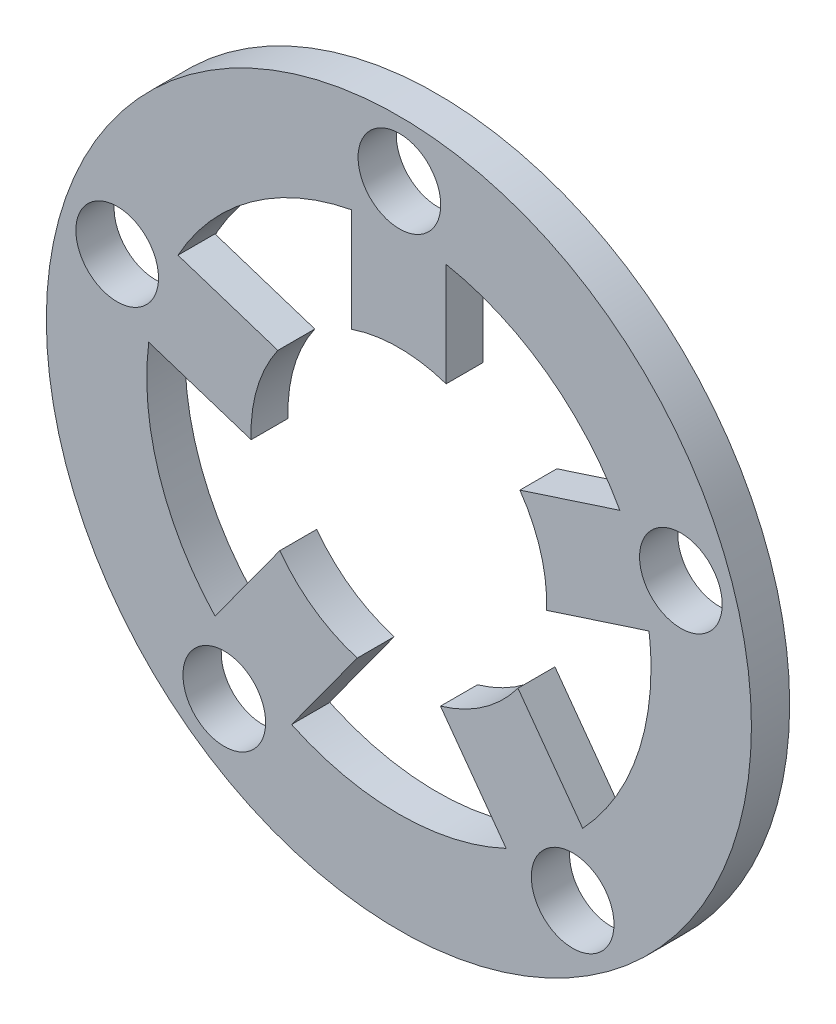
ISO-10303-21;
HEADER;
FILE_DESCRIPTION(('STEP AP214'),'2;1');
FILE_NAME('part.step','',(''),(''),'','','');
FILE_SCHEMA(('AUTOMOTIVE_DESIGN { 1 0 10303 214 1 1 1 1 }'));
ENDSEC;
DATA;
#1=APPLICATION_CONTEXT('core data for automotive mechanical design processes');
#2=APPLICATION_PROTOCOL_DEFINITION('international standard','automotive_design',2000,#1);
#3=PRODUCT_CONTEXT('',#1,'mechanical');
#4=PRODUCT('Part','Part','',(#3));
#5=PRODUCT_RELATED_PRODUCT_CATEGORY('part','',(#4));
#6=PRODUCT_DEFINITION_FORMATION('','',#4);
#7=PRODUCT_DEFINITION_CONTEXT('part definition',#1,'design');
#8=PRODUCT_DEFINITION('design','',#6,#7);
#9=PRODUCT_DEFINITION_SHAPE('','',#8);
#10=(LENGTH_UNIT() NAMED_UNIT(*) SI_UNIT(.MILLI.,.METRE.));
#11=(NAMED_UNIT(*) PLANE_ANGLE_UNIT() SI_UNIT($,.RADIAN.));
#12=(NAMED_UNIT(*) SI_UNIT($,.STERADIAN.) SOLID_ANGLE_UNIT());
#13=UNCERTAINTY_MEASURE_WITH_UNIT(LENGTH_MEASURE(1.E-05),#10,'distance_accuracy_value','');
#14=(GEOMETRIC_REPRESENTATION_CONTEXT(3) GLOBAL_UNCERTAINTY_ASSIGNED_CONTEXT((#13)) GLOBAL_UNIT_ASSIGNED_CONTEXT((#10,
#11,#12)) REPRESENTATION_CONTEXT('',''));
#15=CARTESIAN_POINT('',(0.,0.,0.));
#16=DIRECTION('',(0.,0.,1.));
#17=DIRECTION('',(1.,0.,0.));
#18=AXIS2_PLACEMENT_3D('',#15,#16,#17);
#19=CARTESIAN_POINT('',(3.90838090677538,20.8361843898723,-0.401310706385936));
#20=DIRECTION('',(1.,0.,0.));
#21=DIRECTION('',(0.,0.,-1.));
#22=AXIS2_PLACEMENT_3D('',#19,#20,#21);
#23=PLANE('',#22);
#24=DIRECTION('',(0.,1.,0.));
#25=VECTOR('',#24,1.);
#26=CARTESIAN_POINT('',(3.90838090677538,20.8361843898723,2.65356795503536));
#27=LINE('',#26,#25);
#28=CARTESIAN_POINT('',(3.90838090677538,11.917014137681,2.65356795503536));
#29=VERTEX_POINT('',#28);
#30=CARTESIAN_POINT('',(3.90838090677538,20.4663416031374,2.65356795503536));
#31=VERTEX_POINT('',#30);
#32=EDGE_CURVE('E247',#29,#31,#27,.T.);
#33=ORIENTED_EDGE('',*,*,#32,.F.);
#34=DIRECTION('',(0.,0.,-1.));
#35=VECTOR('',#34,1.);
#36=CARTESIAN_POINT('',(3.90838090677538,11.917014137681,7.874));
#37=LINE('',#36,#35);
#38=CARTESIAN_POINT('',(3.90838090677538,11.917014137681,-0.401310706385936));
#39=VERTEX_POINT('',#38);
#40=EDGE_CURVE('E400',#29,#39,#37,.T.);
#41=ORIENTED_EDGE('',*,*,#40,.T.);
#42=DIRECTION('',(0.,1.,0.));
#43=VECTOR('',#42,1.);
#44=CARTESIAN_POINT('',(3.90838090677538,20.8361843898723,-0.401310706385936));
#45=LINE('',#44,#43);
#46=CARTESIAN_POINT('',(3.90838090677538,20.4663416031374,-0.401310706385936));
#47=VERTEX_POINT('',#46);
#48=EDGE_CURVE('E252',#39,#47,#45,.T.);
#49=ORIENTED_EDGE('',*,*,#48,.T.);
#50=DIRECTION('',(0.,0.,1.));
#51=VECTOR('',#50,1.);
#52=CARTESIAN_POINT('',(3.90838090677538,20.4663416031374,-0.508));
#53=LINE('',#52,#51);
#54=EDGE_CURVE('E259',#31,#47,#53,.F.);
#55=ORIENTED_EDGE('',*,*,#54,.F.);
#56=EDGE_LOOP('',(#33,#41,#49,#55));
#57=FACE_BOUND('',#56,.T.);
#58=ADVANCED_FACE('F37',(#57),#23,.T.);
#59=CARTESIAN_POINT('',(-3.90838090677538,20.8361843898723,-0.401310706385936));
#60=DIRECTION('',(-1.,0.,0.));
#61=DIRECTION('',(0.,0.,1.));
#62=AXIS2_PLACEMENT_3D('',#59,#60,#61);
#63=PLANE('',#62);
#64=DIRECTION('',(0.,-1.,0.));
#65=VECTOR('',#64,1.);
#66=CARTESIAN_POINT('',(-3.90838090677538,20.8361843898723,-0.401310706385936));
#67=LINE('',#66,#65);
#68=CARTESIAN_POINT('',(-3.90838090677538,20.4663416031374,-0.401310706385936));
#69=VERTEX_POINT('',#68);
#70=CARTESIAN_POINT('',(-3.90838090677538,11.917014137681,-0.401310706385936));
#71=VERTEX_POINT('',#70);
#72=EDGE_CURVE('E254',#69,#71,#67,.T.);
#73=ORIENTED_EDGE('',*,*,#72,.T.);
#74=DIRECTION('',(0.,0.,-1.));
#75=VECTOR('',#74,1.);
#76=CARTESIAN_POINT('',(-3.90838090677538,11.917014137681,7.874));
#77=LINE('',#76,#75);
#78=CARTESIAN_POINT('',(-3.90838090677538,11.917014137681,2.65356795503536));
#79=VERTEX_POINT('',#78);
#80=EDGE_CURVE('E396',#71,#79,#77,.F.);
#81=ORIENTED_EDGE('',*,*,#80,.T.);
#82=DIRECTION('',(0.,-1.,0.));
#83=VECTOR('',#82,1.);
#84=CARTESIAN_POINT('',(-3.90838090677538,20.8361843898723,2.65356795503536));
#85=LINE('',#84,#83);
#86=CARTESIAN_POINT('',(-3.90838090677538,20.4663416031374,2.65356795503536));
#87=VERTEX_POINT('',#86);
#88=EDGE_CURVE('E249',#87,#79,#85,.T.);
#89=ORIENTED_EDGE('',*,*,#88,.F.);
#90=DIRECTION('',(0.,0.,1.));
#91=VECTOR('',#90,1.);
#92=CARTESIAN_POINT('',(-3.90838090677538,20.4663416031374,-0.508));
#93=LINE('',#92,#91);
#94=EDGE_CURVE('E257',#69,#87,#93,.T.);
#95=ORIENTED_EDGE('',*,*,#94,.F.);
#96=EDGE_LOOP('',(#73,#81,#89,#95));
#97=FACE_BOUND('',#96,.T.);
#98=ADVANCED_FACE('F443',(#97),#63,.T.);
#99=CARTESIAN_POINT('',(-18.6086328180313,10.1558262039528,-0.401310706385936));
#100=DIRECTION('',(0.309016994374945,0.951056516295155,0.));
#101=DIRECTION('',(-0.951056516295155,0.309016994374945,0.));
#102=AXIS2_PLACEMENT_3D('',#99,#100,#101);
#103=PLANE('',#102);
#104=DIRECTION('',(-0.951056516295155,0.309016994374945,0.));
#105=VECTOR('',#104,1.);
#106=CARTESIAN_POINT('',(-18.6086328180313,10.1558262039528,2.65356795503536));
#107=LINE('',#106,#105);
#108=CARTESIAN_POINT('',(-10.0014947486015,7.35919751699898,2.65356795503536));
#109=VERTEX_POINT('',#108);
#110=CARTESIAN_POINT('',(-18.2568914257023,10.0415384976047,2.65356795503536));
#111=VERTEX_POINT('',#110);
#112=EDGE_CURVE('E232',#109,#111,#107,.T.);
#113=ORIENTED_EDGE('',*,*,#112,.F.);
#114=DIRECTION('',(0.,0.,-1.));
#115=VECTOR('',#114,1.);
#116=CARTESIAN_POINT('',(-10.0014947486015,7.35919751699898,7.874));
#117=LINE('',#116,#115);
#118=CARTESIAN_POINT('',(-10.0014947486015,7.35919751699898,-0.401310706385936));
#119=VERTEX_POINT('',#118);
#120=EDGE_CURVE('E393',#109,#119,#117,.T.);
#121=ORIENTED_EDGE('',*,*,#120,.T.);
#122=DIRECTION('',(-0.951056516295155,0.309016994374945,0.));
#123=VECTOR('',#122,1.);
#124=CARTESIAN_POINT('',(-18.6086328180313,10.1558262039528,-0.401310706385936));
#125=LINE('',#124,#123);
#126=CARTESIAN_POINT('',(-18.2568914257023,10.0415384976047,-0.401310706385936));
#127=VERTEX_POINT('',#126);
#128=EDGE_CURVE('E237',#119,#127,#125,.T.);
#129=ORIENTED_EDGE('',*,*,#128,.T.);
#130=DIRECTION('',(0.,0.,1.));
#131=VECTOR('',#130,1.);
#132=CARTESIAN_POINT('',(-18.2568914257023,10.0415384976047,-0.508));
#133=LINE('',#132,#131);
#134=EDGE_CURVE('E244',#111,#127,#133,.F.);
#135=ORIENTED_EDGE('',*,*,#134,.F.);
#136=EDGE_LOOP('',(#113,#121,#129,#135));
#137=FACE_BOUND('',#136,.T.);
#138=ADVANCED_FACE('F448',(#137),#103,.T.);
#139=CARTESIAN_POINT('',(-21.0241450593996,2.72164394484819,-0.401310706385936));
#140=DIRECTION('',(-0.309016994374945,-0.951056516295155,0.));
#141=DIRECTION('',(0.951056516295155,-0.309016994374945,0.));
#142=AXIS2_PLACEMENT_3D('',#139,#140,#141);
#143=PLANE('',#142);
#144=DIRECTION('',(0.951056516295155,-0.309016994374945,0.));
#145=VECTOR('',#144,1.);
#146=CARTESIAN_POINT('',(-21.0241450593996,2.72164394484819,-0.401310706385936));
#147=LINE('',#146,#145);
#148=CARTESIAN_POINT('',(-20.6724036670706,2.60735623850011,-0.401310706385936));
#149=VERTEX_POINT('',#148);
#150=CARTESIAN_POINT('',(-12.209018290216,-0.142564367249465,-0.401310706385936));
#151=VERTEX_POINT('',#150);
#152=EDGE_CURVE('E239',#149,#151,#147,.T.);
#153=ORIENTED_EDGE('',*,*,#152,.T.);
#154=DIRECTION('',(0.,0.,-1.));
#155=VECTOR('',#154,1.);
#156=CARTESIAN_POINT('',(-12.209018290216,-0.142564367249465,7.874));
#157=LINE('',#156,#155);
#158=CARTESIAN_POINT('',(-12.209018290216,-0.142564367249466,2.65356795503536));
#159=VERTEX_POINT('',#158);
#160=EDGE_CURVE('E389',#151,#159,#157,.F.);
#161=ORIENTED_EDGE('',*,*,#160,.T.);
#162=DIRECTION('',(0.951056516295155,-0.309016994374945,0.));
#163=VECTOR('',#162,1.);
#164=CARTESIAN_POINT('',(-21.0241450593996,2.72164394484819,2.65356795503536));
#165=LINE('',#164,#163);
#166=CARTESIAN_POINT('',(-20.6724036670706,2.60735623850011,2.65356795503536));
#167=VERTEX_POINT('',#166);
#168=EDGE_CURVE('E234',#167,#159,#165,.T.);
#169=ORIENTED_EDGE('',*,*,#168,.F.);
#170=DIRECTION('',(0.,0.,1.));
#171=VECTOR('',#170,1.);
#172=CARTESIAN_POINT('',(-20.6724036670706,2.60735623850011,-0.508));
#173=LINE('',#172,#171);
#174=EDGE_CURVE('E242',#149,#167,#173,.T.);
#175=ORIENTED_EDGE('',*,*,#174,.F.);
#176=EDGE_LOOP('',(#153,#161,#169,#175));
#177=FACE_BOUND('',#176,.T.);
#178=ADVANCED_FACE('F454',(#177),#143,.T.);
#179=CARTESIAN_POINT('',(-15.4091484724853,-14.5595386119927,-0.401310706385936));
#180=DIRECTION('',(-0.809016994374951,0.587785252292469,0.));
#181=DIRECTION('',(-0.587785252292469,-0.809016994374951,0.));
#182=AXIS2_PLACEMENT_3D('',#179,#180,#181);
#183=PLANE('',#182);
#184=DIRECTION('',(-0.587785252292469,-0.809016994374951,0.));
#185=VECTOR('',#184,1.);
#186=CARTESIAN_POINT('',(-15.4091484724853,-14.5595386119927,2.65356795503536));
#187=LINE('',#186,#185);
#188=CARTESIAN_POINT('',(-9.84321675159616,-6.89869082078375,2.65356795503536));
#189=VERTEX_POINT('',#188);
#190=CARTESIAN_POINT('',(-15.1917603367758,-14.2603295122772,2.65356795503536));
#191=VERTEX_POINT('',#190);
#192=EDGE_CURVE('E217',#189,#191,#187,.T.);
#193=ORIENTED_EDGE('',*,*,#192,.F.);
#194=DIRECTION('',(0.,0.,-1.));
#195=VECTOR('',#194,1.);
#196=CARTESIAN_POINT('',(-9.84321675159616,-6.89869082078375,7.874));
#197=LINE('',#196,#195);
#198=CARTESIAN_POINT('',(-9.84321675159616,-6.89869082078375,-0.401310706385936));
#199=VERTEX_POINT('',#198);
#200=EDGE_CURVE('E344',#189,#199,#197,.T.);
#201=ORIENTED_EDGE('',*,*,#200,.T.);
#202=DIRECTION('',(-0.587785252292469,-0.809016994374951,0.));
#203=VECTOR('',#202,1.);
#204=CARTESIAN_POINT('',(-15.4091484724853,-14.5595386119927,-0.401310706385936));
#205=LINE('',#204,#203);
#206=CARTESIAN_POINT('',(-15.1917603367758,-14.2603295122772,-0.401310706385936));
#207=VERTEX_POINT('',#206);
#208=EDGE_CURVE('E222',#199,#207,#205,.T.);
#209=ORIENTED_EDGE('',*,*,#208,.T.);
#210=DIRECTION('',(0.,0.,1.));
#211=VECTOR('',#210,1.);
#212=CARTESIAN_POINT('',(-15.1917603367758,-14.2603295122772,-0.508));
#213=LINE('',#212,#211);
#214=EDGE_CURVE('E229',#191,#207,#213,.F.);
#215=ORIENTED_EDGE('',*,*,#214,.F.);
#216=EDGE_LOOP('',(#193,#201,#209,#215));
#217=FACE_BOUND('',#216,.T.);
#218=ADVANCED_FACE('F341',(#217),#183,.T.);
#219=CARTESIAN_POINT('',(-9.08525532434163,-19.1541159266808,-0.401310706385936));
#220=DIRECTION('',(0.809016994374951,-0.587785252292469,0.));
#221=DIRECTION('',(0.587785252292469,0.809016994374951,0.));
#222=AXIS2_PLACEMENT_3D('',#219,#220,#221);
#223=PLANE('',#222);
#224=DIRECTION('',(0.587785252292469,0.809016994374951,0.));
#225=VECTOR('',#224,1.);
#226=CARTESIAN_POINT('',(-9.08525532434163,-19.1541159266808,-0.401310706385936));
#227=LINE('',#226,#225);
#228=CARTESIAN_POINT('',(-8.86786718863209,-18.8549068269652,-0.401310706385936));
#229=VERTEX_POINT('',#228);
#230=CARTESIAN_POINT('',(-3.43990038951023,-11.383951459736,-0.401310706385936));
#231=VERTEX_POINT('',#230);
#232=EDGE_CURVE('E224',#229,#231,#227,.T.);
#233=ORIENTED_EDGE('',*,*,#232,.T.);
#234=DIRECTION('',(0.,0.,-1.));
#235=VECTOR('',#234,1.);
#236=CARTESIAN_POINT('',(-3.43990038951023,-11.383951459736,7.874));
#237=LINE('',#236,#235);
#238=CARTESIAN_POINT('',(-3.43990038951023,-11.383951459736,2.65356795503536));
#239=VERTEX_POINT('',#238);
#240=EDGE_CURVE('E355',#231,#239,#237,.F.);
#241=ORIENTED_EDGE('',*,*,#240,.T.);
#242=DIRECTION('',(0.587785252292469,0.809016994374951,0.));
#243=VECTOR('',#242,1.);
#244=CARTESIAN_POINT('',(-9.08525532434163,-19.1541159266808,2.65356795503536));
#245=LINE('',#244,#243);
#246=CARTESIAN_POINT('',(-8.86786718863209,-18.8549068269652,2.65356795503536));
#247=VERTEX_POINT('',#246);
#248=EDGE_CURVE('E219',#247,#239,#245,.T.);
#249=ORIENTED_EDGE('',*,*,#248,.F.);
#250=DIRECTION('',(0.,0.,1.));
#251=VECTOR('',#250,1.);
#252=CARTESIAN_POINT('',(-8.86786718863209,-18.8549068269652,-0.508));
#253=LINE('',#252,#251);
#254=EDGE_CURVE('E227',#229,#247,#253,.T.);
#255=ORIENTED_EDGE('',*,*,#254,.F.);
#256=EDGE_LOOP('',(#233,#241,#249,#255));
#257=FACE_BOUND('',#256,.T.);
#258=ADVANCED_FACE('F353',(#257),#223,.T.);
#259=CARTESIAN_POINT('',(9.0852553243419,-19.1541159266807,-0.401310706385936));
#260=DIRECTION('',(-0.809016994374942,-0.58778525229248,0.));
#261=DIRECTION('',(0.58778525229248,-0.809016994374942,0.));
#262=AXIS2_PLACEMENT_3D('',#259,#260,#261);
#263=PLANE('',#262);
#264=DIRECTION('',(0.58778525229248,-0.809016994374942,0.));
#265=VECTOR('',#264,1.);
#266=CARTESIAN_POINT('',(9.0852553243419,-19.1541159266807,2.65356795503536));
#267=LINE('',#266,#265);
#268=CARTESIAN_POINT('',(3.4399003895104,-11.383951459736,2.65356795503536));
#269=VERTEX_POINT('',#268);
#270=CARTESIAN_POINT('',(8.86786718863237,-18.8549068269651,2.65356795503536));
#271=VERTEX_POINT('',#270);
#272=EDGE_CURVE('E202',#269,#271,#267,.T.);
#273=ORIENTED_EDGE('',*,*,#272,.F.);
#274=DIRECTION('',(0.,0.,-1.));
#275=VECTOR('',#274,1.);
#276=CARTESIAN_POINT('',(3.4399003895104,-11.383951459736,7.874));
#277=LINE('',#276,#275);
#278=CARTESIAN_POINT('',(3.4399003895104,-11.383951459736,-0.401310706385936));
#279=VERTEX_POINT('',#278);
#280=EDGE_CURVE('E364',#269,#279,#277,.T.);
#281=ORIENTED_EDGE('',*,*,#280,.T.);
#282=DIRECTION('',(0.58778525229248,-0.809016994374942,0.));
#283=VECTOR('',#282,1.);
#284=CARTESIAN_POINT('',(9.0852553243419,-19.1541159266807,-0.401310706385936));
#285=LINE('',#284,#283);
#286=CARTESIAN_POINT('',(8.86786718863237,-18.8549068269651,-0.401310706385936));
#287=VERTEX_POINT('',#286);
#288=EDGE_CURVE('E207',#279,#287,#285,.T.);
#289=ORIENTED_EDGE('',*,*,#288,.T.);
#290=DIRECTION('',(0.,0.,1.));
#291=VECTOR('',#290,1.);
#292=CARTESIAN_POINT('',(8.86786718863237,-18.8549068269651,-0.508));
#293=LINE('',#292,#291);
#294=EDGE_CURVE('E214',#271,#287,#293,.F.);
#295=ORIENTED_EDGE('',*,*,#294,.F.);
#296=EDGE_LOOP('',(#273,#281,#289,#295));
#297=FACE_BOUND('',#296,.T.);
#298=ADVANCED_FACE('F363',(#297),#263,.T.);
#299=CARTESIAN_POINT('',(15.4091484724856,-14.5595386119925,-0.401310706385936));
#300=DIRECTION('',(0.809016994374942,0.58778525229248,0.));
#301=DIRECTION('',(-0.58778525229248,0.809016994374942,0.));
#302=AXIS2_PLACEMENT_3D('',#299,#300,#301);
#303=PLANE('',#302);
#304=DIRECTION('',(-0.58778525229248,0.809016994374942,0.));
#305=VECTOR('',#304,1.);
#306=CARTESIAN_POINT('',(15.4091484724856,-14.5595386119925,-0.401310706385936));
#307=LINE('',#306,#305);
#308=CARTESIAN_POINT('',(15.191760336776,-14.260329512277,-0.401310706385936));
#309=VERTEX_POINT('',#308);
#310=CARTESIAN_POINT('',(9.84321675159626,-6.89869082078361,-0.401310706385936));
#311=VERTEX_POINT('',#310);
#312=EDGE_CURVE('E209',#309,#311,#307,.T.);
#313=ORIENTED_EDGE('',*,*,#312,.T.);
#314=DIRECTION('',(0.,0.,-1.));
#315=VECTOR('',#314,1.);
#316=CARTESIAN_POINT('',(9.84321675159626,-6.89869082078361,7.874));
#317=LINE('',#316,#315);
#318=CARTESIAN_POINT('',(9.84321675159627,-6.89869082078361,2.65356795503536));
#319=VERTEX_POINT('',#318);
#320=EDGE_CURVE('E376',#311,#319,#317,.F.);
#321=ORIENTED_EDGE('',*,*,#320,.T.);
#322=DIRECTION('',(-0.58778525229248,0.809016994374942,0.));
#323=VECTOR('',#322,1.);
#324=CARTESIAN_POINT('',(15.4091484724856,-14.5595386119925,2.65356795503536));
#325=LINE('',#324,#323);
#326=CARTESIAN_POINT('',(15.191760336776,-14.260329512277,2.65356795503536));
#327=VERTEX_POINT('',#326);
#328=EDGE_CURVE('E204',#327,#319,#325,.T.);
#329=ORIENTED_EDGE('',*,*,#328,.F.);
#330=DIRECTION('',(0.,0.,1.));
#331=VECTOR('',#330,1.);
#332=CARTESIAN_POINT('',(15.191760336776,-14.260329512277,-0.508));
#333=LINE('',#332,#331);
#334=EDGE_CURVE('E212',#309,#327,#333,.T.);
#335=ORIENTED_EDGE('',*,*,#334,.F.);
#336=EDGE_LOOP('',(#313,#321,#329,#335));
#337=FACE_BOUND('',#336,.T.);
#338=ADVANCED_FACE('F374',(#337),#303,.T.);
#339=CARTESIAN_POINT('',(21.0241450593995,2.72164394484849,-0.401310706385936));
#340=DIRECTION('',(0.309016994374958,-0.95105651629515,0.));
#341=DIRECTION('',(0.95105651629515,0.309016994374958,0.));
#342=AXIS2_PLACEMENT_3D('',#339,#340,#341);
#343=PLANE('',#342);
#344=DIRECTION('',(0.95105651629515,0.309016994374958,0.));
#345=VECTOR('',#344,1.);
#346=CARTESIAN_POINT('',(21.0241450593995,2.72164394484849,2.65356795503536));
#347=LINE('',#346,#345);
#348=CARTESIAN_POINT('',(12.209018290216,-0.14256436724929,2.65356795503536));
#349=VERTEX_POINT('',#348);
#350=CARTESIAN_POINT('',(20.6724036670705,2.60735623850041,2.65356795503536));
#351=VERTEX_POINT('',#350);
#352=EDGE_CURVE('E292',#349,#351,#347,.T.);
#353=ORIENTED_EDGE('',*,*,#352,.F.);
#354=DIRECTION('',(0.,0.,-1.));
#355=VECTOR('',#354,1.);
#356=CARTESIAN_POINT('',(12.209018290216,-0.14256436724929,7.874));
#357=LINE('',#356,#355);
#358=CARTESIAN_POINT('',(12.209018290216,-0.14256436724929,-0.401310706385936));
#359=VERTEX_POINT('',#358);
#360=EDGE_CURVE('E379',#349,#359,#357,.T.);
#361=ORIENTED_EDGE('',*,*,#360,.T.);
#362=DIRECTION('',(0.95105651629515,0.309016994374958,0.));
#363=VECTOR('',#362,1.);
#364=CARTESIAN_POINT('',(21.0241450593995,2.72164394484849,-0.401310706385936));
#365=LINE('',#364,#363);
#366=CARTESIAN_POINT('',(20.6724036670705,2.60735623850041,-0.401310706385936));
#367=VERTEX_POINT('',#366);
#368=EDGE_CURVE('E188',#359,#367,#365,.T.);
#369=ORIENTED_EDGE('',*,*,#368,.T.);
#370=DIRECTION('',(0.,0.,1.));
#371=VECTOR('',#370,1.);
#372=CARTESIAN_POINT('',(20.6724036670705,2.60735623850041,-0.508));
#373=LINE('',#372,#371);
#374=EDGE_CURVE('E194',#351,#367,#373,.F.);
#375=ORIENTED_EDGE('',*,*,#374,.F.);
#376=EDGE_LOOP('',(#353,#361,#369,#375));
#377=FACE_BOUND('',#376,.T.);
#378=ADVANCED_FACE('F378',(#377),#343,.T.);
#379=CARTESIAN_POINT('',(18.6086328180311,10.155826203953,-0.401310706385936));
#380=DIRECTION('',(-0.309016994374958,0.95105651629515,0.));
#381=DIRECTION('',(-0.95105651629515,-0.309016994374958,0.));
#382=AXIS2_PLACEMENT_3D('',#379,#380,#381);
#383=PLANE('',#382);
#384=DIRECTION('',(-0.95105651629515,-0.309016994374958,0.));
#385=VECTOR('',#384,1.);
#386=CARTESIAN_POINT('',(18.6086328180311,10.155826203953,-0.401310706385936));
#387=LINE('',#386,#385);
#388=CARTESIAN_POINT('',(18.2568914257021,10.041538497605,-0.401310706385936));
#389=VERTEX_POINT('',#388);
#390=CARTESIAN_POINT('',(10.0014947486014,7.35919751699912,-0.401310706385936));
#391=VERTEX_POINT('',#390);
#392=EDGE_CURVE('E187',#389,#391,#387,.T.);
#393=ORIENTED_EDGE('',*,*,#392,.T.);
#394=DIRECTION('',(0.,0.,-1.));
#395=VECTOR('',#394,1.);
#396=CARTESIAN_POINT('',(10.0014947486014,7.35919751699912,7.874));
#397=LINE('',#396,#395);
#398=CARTESIAN_POINT('',(10.0014947486014,7.35919751699912,2.65356795503536));
#399=VERTEX_POINT('',#398);
#400=EDGE_CURVE('E11',#391,#399,#397,.F.);
#401=ORIENTED_EDGE('',*,*,#400,.T.);
#402=DIRECTION('',(-0.95105651629515,-0.309016994374958,0.));
#403=VECTOR('',#402,1.);
#404=CARTESIAN_POINT('',(18.6086328180311,10.155826203953,2.65356795503536));
#405=LINE('',#404,#403);
#406=CARTESIAN_POINT('',(18.2568914257021,10.041538497605,2.65356795503536));
#407=VERTEX_POINT('',#406);
#408=EDGE_CURVE('E196',#407,#399,#405,.T.);
#409=ORIENTED_EDGE('',*,*,#408,.F.);
#410=DIRECTION('',(0.,0.,1.));
#411=VECTOR('',#410,1.);
#412=CARTESIAN_POINT('',(18.2568914257021,10.041538497605,-0.508));
#413=LINE('',#412,#411);
#414=EDGE_CURVE('E192',#389,#407,#413,.T.);
#415=ORIENTED_EDGE('',*,*,#414,.F.);
#416=EDGE_LOOP('',(#393,#401,#409,#415));
#417=FACE_BOUND('',#416,.T.);
#418=ADVANCED_FACE('F191',(#417),#383,.T.);
#419=CARTESIAN_POINT('',(0.,0.,-0.508));
#420=DIRECTION('',(0.,0.,1.));
#421=DIRECTION('',(1.,0.,0.));
#422=AXIS2_PLACEMENT_3D('',#419,#420,#421);
#423=CYLINDRICAL_SURFACE('',#422,29.138416471441);
#424=CARTESIAN_POINT('',(0.,0.,-0.508));
#425=DIRECTION('',(0.,0.,1.));
#426=DIRECTION('',(1.,0.,0.));
#427=AXIS2_PLACEMENT_3D('',#424,#425,#426);
#428=CIRCLE('',#427,29.138416471441);
#429=CARTESIAN_POINT('',(29.138416471441,0.,-0.508));
#430=VERTEX_POINT('',#429);
#431=EDGE_CURVE('E273',#430,#430,#428,.T.);
#432=ORIENTED_EDGE('',*,*,#431,.T.);
#433=EDGE_LOOP('',(#432));
#434=FACE_BOUND('',#433,.T.);
#435=CARTESIAN_POINT('',(0.,0.,2.65356795503536));
#436=DIRECTION('',(0.,0.,1.));
#437=DIRECTION('',(1.,0.,0.));
#438=AXIS2_PLACEMENT_3D('',#435,#436,#437);
#439=CIRCLE('',#438,29.138416471441);
#440=CARTESIAN_POINT('',(29.138416471441,0.,2.65356795503536));
#441=VERTEX_POINT('',#440);
#442=EDGE_CURVE('E266',#441,#441,#439,.T.);
#443=ORIENTED_EDGE('',*,*,#442,.F.);
#444=EDGE_LOOP('',(#443));
#445=FACE_BOUND('',#444,.T.);
#446=ADVANCED_FACE('F39',(#434,#445),#423,.T.);
#447=CARTESIAN_POINT('',(0.,0.,-0.508));
#448=DIRECTION('',(0.,0.,1.));
#449=DIRECTION('',(1.,0.,0.));
#450=AXIS2_PLACEMENT_3D('',#447,#448,#449);
#451=PLANE('',#450);
#452=CARTESIAN_POINT('',(0.0420965497782916,24.492983502377,-0.508));
#453=DIRECTION('',(0.,0.,-1.));
#454=DIRECTION('',(-0.309016994374945,-0.951056516295155,0.));
#455=AXIS2_PLACEMENT_3D('',#452,#453,#454);
#456=CIRCLE('',#455,3.41622596407658);
#457=CARTESIAN_POINT('',(-1.0135753297463,21.2439595381053,-0.508));
#458=VERTEX_POINT('',#457);
#459=EDGE_CURVE('E298',#458,#458,#456,.T.);
#460=ORIENTED_EDGE('',*,*,#459,.F.);
#461=EDGE_LOOP('',(#460));
#462=FACE_BOUND('',#461,.T.);
#463=CARTESIAN_POINT('',(-23.2812030141593,7.60878434315984,-0.508));
#464=DIRECTION('',(0.,0.,-1.));
#465=DIRECTION('',(0.809016994374951,-0.587785252292469,0.));
#466=AXIS2_PLACEMENT_3D('',#463,#464,#465);
#467=CIRCLE('',#466,3.41622596407658);
#468=CARTESIAN_POINT('',(-20.5174181525964,5.600777102977,-0.508));
#469=VERTEX_POINT('',#468);
#470=EDGE_CURVE('E405',#469,#469,#467,.T.);
#471=ORIENTED_EDGE('',*,*,#470,.F.);
#472=EDGE_LOOP('',(#471));
#473=FACE_BOUND('',#472,.T.);
#474=CARTESIAN_POINT('',(-14.4306713115151,-19.7904961652362,-0.508));
#475=DIRECTION('',(0.,0.,-1.));
#476=DIRECTION('',(0.809016994374942,0.58778525229248,0.));
#477=AXIS2_PLACEMENT_3D('',#474,#475,#476);
#478=CIRCLE('',#477,3.41622596407658);
#479=CARTESIAN_POINT('',(-11.6668864499522,-17.7824889250534,-0.508));
#480=VERTEX_POINT('',#479);
#481=EDGE_CURVE('E407',#480,#480,#478,.T.);
#482=ORIENTED_EDGE('',*,*,#481,.F.);
#483=EDGE_LOOP('',(#482));
#484=FACE_BOUND('',#483,.T.);
#485=CARTESIAN_POINT('',(14.362557663165,-19.8399836275002,-0.508));
#486=DIRECTION('',(0.,0.,-1.));
#487=DIRECTION('',(-0.309016994374958,0.95105651629515,0.));
#488=AXIS2_PLACEMENT_3D('',#485,#486,#487);
#489=CIRCLE('',#488,3.41622596407658);
#490=CARTESIAN_POINT('',(13.3068857836404,-16.5909596632285,-0.508));
#491=VERTEX_POINT('',#490);
#492=EDGE_CURVE('E313',#491,#491,#489,.T.);
#493=ORIENTED_EDGE('',*,*,#492,.F.);
#494=EDGE_LOOP('',(#493));
#495=FACE_BOUND('',#494,.T.);
#496=CARTESIAN_POINT('',(23.3072201127314,7.52871194719946,-0.508));
#497=DIRECTION('',(0.,0.,-1.));
#498=DIRECTION('',(-1.,0.,0.));
#499=AXIS2_PLACEMENT_3D('',#496,#497,#498);
#500=CIRCLE('',#499,3.41622596407658);
#501=CARTESIAN_POINT('',(19.8909941486548,7.52871194719946,-0.508));
#502=VERTEX_POINT('',#501);
#503=EDGE_CURVE('E293',#502,#502,#500,.T.);
#504=ORIENTED_EDGE('',*,*,#503,.F.);
#505=EDGE_LOOP('',(#504));
#506=FACE_BOUND('',#505,.T.);
#507=CARTESIAN_POINT('',(0.,0.,-0.508));
#508=DIRECTION('',(0.,0.,1.));
#509=DIRECTION('',(1.,0.,0.));
#510=AXIS2_PLACEMENT_3D('',#507,#508,#509);
#511=CIRCLE('',#510,20.8361843898723);
#512=CARTESIAN_POINT('',(20.8361843898723,0.,-0.508));
#513=VERTEX_POINT('',#512);
#514=EDGE_CURVE('E270',#513,#513,#511,.T.);
#515=ORIENTED_EDGE('',*,*,#514,.T.);
#516=EDGE_LOOP('',(#515));
#517=FACE_BOUND('',#516,.T.);
#518=ORIENTED_EDGE('',*,*,#431,.F.);
#519=EDGE_LOOP('',(#518));
#520=FACE_BOUND('',#519,.T.);
#521=ADVANCED_FACE('F416',(#462,#473,#484,#495,#506,#517,#520),#451,.F.);
#522=CARTESIAN_POINT('',(0.,0.,-0.508));
#523=DIRECTION('',(0.,0.,1.));
#524=DIRECTION('',(1.,0.,0.));
#525=AXIS2_PLACEMENT_3D('',#522,#523,#524);
#526=CYLINDRICAL_SURFACE('',#525,20.8361843898723);
#527=CARTESIAN_POINT('',(0.,0.,2.65356795503536));
#528=DIRECTION('',(0.,0.,1.));
#529=DIRECTION('',(1.,0.,0.));
#530=AXIS2_PLACEMENT_3D('',#527,#528,#529);
#531=CIRCLE('',#530,20.8361843898723);
#532=EDGE_CURVE('E324',#327,#351,#531,.T.);
#533=ORIENTED_EDGE('',*,*,#532,.T.);
#534=ORIENTED_EDGE('',*,*,#374,.T.);
#535=CARTESIAN_POINT('',(0.,0.,-0.401310706385936));
#536=DIRECTION('',(0.,0.,1.));
#537=DIRECTION('',(1.,0.,0.));
#538=AXIS2_PLACEMENT_3D('',#535,#536,#537);
#539=CIRCLE('',#538,20.8361843898723);
#540=EDGE_CURVE('E45',#389,#367,#539,.F.);
#541=ORIENTED_EDGE('',*,*,#540,.F.);
#542=ORIENTED_EDGE('',*,*,#414,.T.);
#543=EDGE_CURVE('E262',#407,#31,#531,.T.);
#544=ORIENTED_EDGE('',*,*,#543,.T.);
#545=ORIENTED_EDGE('',*,*,#54,.T.);
#546=CARTESIAN_POINT('',(0.,0.,-0.401310706385936));
#547=DIRECTION('',(0.,0.,1.));
#548=DIRECTION('',(1.,0.,0.));
#549=AXIS2_PLACEMENT_3D('',#546,#547,#548);
#550=CIRCLE('',#549,20.8361843898723);
#551=EDGE_CURVE('E276',#69,#47,#550,.F.);
#552=ORIENTED_EDGE('',*,*,#551,.F.);
#553=ORIENTED_EDGE('',*,*,#94,.T.);
#554=EDGE_CURVE('E263',#87,#111,#531,.T.);
#555=ORIENTED_EDGE('',*,*,#554,.T.);
#556=ORIENTED_EDGE('',*,*,#134,.T.);
#557=CARTESIAN_POINT('',(0.,0.,-0.401310706385936));
#558=DIRECTION('',(0.,0.,1.));
#559=DIRECTION('',(1.,0.,0.));
#560=AXIS2_PLACEMENT_3D('',#557,#558,#559);
#561=CIRCLE('',#560,20.8361843898723);
#562=EDGE_CURVE('E279',#149,#127,#561,.F.);
#563=ORIENTED_EDGE('',*,*,#562,.F.);
#564=ORIENTED_EDGE('',*,*,#174,.T.);
#565=EDGE_CURVE('E267',#167,#191,#531,.T.);
#566=ORIENTED_EDGE('',*,*,#565,.T.);
#567=ORIENTED_EDGE('',*,*,#214,.T.);
#568=CARTESIAN_POINT('',(0.,0.,-0.401310706385936));
#569=DIRECTION('',(0.,0.,1.));
#570=DIRECTION('',(1.,0.,0.));
#571=AXIS2_PLACEMENT_3D('',#568,#569,#570);
#572=CIRCLE('',#571,20.8361843898723);
#573=EDGE_CURVE('E282',#229,#207,#572,.F.);
#574=ORIENTED_EDGE('',*,*,#573,.F.);
#575=ORIENTED_EDGE('',*,*,#254,.T.);
#576=EDGE_CURVE('E326',#247,#271,#531,.T.);
#577=ORIENTED_EDGE('',*,*,#576,.T.);
#578=ORIENTED_EDGE('',*,*,#294,.T.);
#579=CARTESIAN_POINT('',(0.,0.,-0.401310706385936));
#580=DIRECTION('',(0.,0.,1.));
#581=DIRECTION('',(1.,0.,0.));
#582=AXIS2_PLACEMENT_3D('',#579,#580,#581);
#583=CIRCLE('',#582,20.8361843898723);
#584=EDGE_CURVE('E285',#309,#287,#583,.F.);
#585=ORIENTED_EDGE('',*,*,#584,.F.);
#586=ORIENTED_EDGE('',*,*,#334,.T.);
#587=EDGE_LOOP('',(#533,#534,#541,#542,#544,#545,#552,#553,#555,#556,#563,#564,#566,#567,#574,
#575,#577,#578,#585,#586));
#588=FACE_BOUND('',#587,.T.);
#589=ORIENTED_EDGE('',*,*,#514,.F.);
#590=EDGE_LOOP('',(#589));
#591=FACE_BOUND('',#590,.T.);
#592=ADVANCED_FACE('F335',(#588,#591),#526,.F.);
#593=CARTESIAN_POINT('',(0.,0.,2.65356795503536));
#594=DIRECTION('',(0.,0.,1.));
#595=DIRECTION('',(1.,0.,0.));
#596=AXIS2_PLACEMENT_3D('',#593,#594,#595);
#597=PLANE('',#596);
#598=CARTESIAN_POINT('',(0.0420965497782916,24.492983502377,2.65356795503536));
#599=DIRECTION('',(0.,0.,1.));
#600=DIRECTION('',(1.,0.,0.));
#601=AXIS2_PLACEMENT_3D('',#598,#599,#600);
#602=CIRCLE('',#601,3.41622596407658);
#603=CARTESIAN_POINT('',(3.45832251385487,24.492983502377,2.65356795503536));
#604=VERTEX_POINT('',#603);
#605=EDGE_CURVE('E303',#604,#604,#602,.T.);
#606=ORIENTED_EDGE('',*,*,#605,.F.);
#607=EDGE_LOOP('',(#606));
#608=FACE_BOUND('',#607,.T.);
#609=CARTESIAN_POINT('',(-23.2812030141593,7.60878434315984,2.65356795503536));
#610=DIRECTION('',(0.,0.,1.));
#611=DIRECTION('',(1.,0.,0.));
#612=AXIS2_PLACEMENT_3D('',#609,#610,#611);
#613=CIRCLE('',#612,3.41622596407658);
#614=CARTESIAN_POINT('',(-19.8649770500827,7.60878434315984,2.65356795503536));
#615=VERTEX_POINT('',#614);
#616=EDGE_CURVE('E301',#615,#615,#613,.T.);
#617=ORIENTED_EDGE('',*,*,#616,.F.);
#618=EDGE_LOOP('',(#617));
#619=FACE_BOUND('',#618,.T.);
#620=CARTESIAN_POINT('',(-14.4306713115151,-19.7904961652362,2.65356795503536));
#621=DIRECTION('',(0.,0.,1.));
#622=DIRECTION('',(1.,0.,0.));
#623=AXIS2_PLACEMENT_3D('',#620,#621,#622);
#624=CIRCLE('',#623,3.41622596407658);
#625=CARTESIAN_POINT('',(-11.0144453474385,-19.7904961652362,2.65356795503536));
#626=VERTEX_POINT('',#625);
#627=EDGE_CURVE('E297',#626,#626,#624,.T.);
#628=ORIENTED_EDGE('',*,*,#627,.F.);
#629=EDGE_LOOP('',(#628));
#630=FACE_BOUND('',#629,.T.);
#631=CARTESIAN_POINT('',(14.362557663165,-19.8399836275002,2.65356795503536));
#632=DIRECTION('',(0.,0.,1.));
#633=DIRECTION('',(1.,0.,0.));
#634=AXIS2_PLACEMENT_3D('',#631,#632,#633);
#635=CIRCLE('',#634,3.41622596407658);
#636=CARTESIAN_POINT('',(17.7787836272416,-19.8399836275002,2.65356795503536));
#637=VERTEX_POINT('',#636);
#638=EDGE_CURVE('E294',#637,#637,#635,.T.);
#639=ORIENTED_EDGE('',*,*,#638,.F.);
#640=EDGE_LOOP('',(#639));
#641=FACE_BOUND('',#640,.T.);
#642=CARTESIAN_POINT('',(23.3072201127314,7.52871194719946,2.65356795503536));
#643=DIRECTION('',(0.,0.,1.));
#644=DIRECTION('',(1.,0.,0.));
#645=AXIS2_PLACEMENT_3D('',#642,#643,#644);
#646=CIRCLE('',#645,3.41622596407658);
#647=CARTESIAN_POINT('',(26.723446076808,7.52871194719946,2.65356795503536));
#648=VERTEX_POINT('',#647);
#649=EDGE_CURVE('E289',#648,#648,#646,.T.);
#650=ORIENTED_EDGE('',*,*,#649,.F.);
#651=EDGE_LOOP('',(#650));
#652=FACE_BOUND('',#651,.T.);
#653=ORIENTED_EDGE('',*,*,#328,.T.);
#654=CARTESIAN_POINT('',(0.,0.340402239478725,2.65356795503536));
#655=DIRECTION('',(0.,0.,1.));
#656=DIRECTION('',(1.,0.,0.));
#657=AXIS2_PLACEMENT_3D('',#654,#655,#656);
#658=CIRCLE('',#657,12.2185671972635);
#659=EDGE_CURVE('E360',#319,#269,#658,.F.);
#660=ORIENTED_EDGE('',*,*,#659,.T.);
#661=ORIENTED_EDGE('',*,*,#272,.T.);
#662=ORIENTED_EDGE('',*,*,#576,.F.);
#663=ORIENTED_EDGE('',*,*,#248,.T.);
#664=EDGE_CURVE('E357',#239,#189,#658,.F.);
#665=ORIENTED_EDGE('',*,*,#664,.T.);
#666=ORIENTED_EDGE('',*,*,#192,.T.);
#667=ORIENTED_EDGE('',*,*,#565,.F.);
#668=ORIENTED_EDGE('',*,*,#168,.T.);
#669=EDGE_CURVE('E60',#159,#109,#658,.F.);
#670=ORIENTED_EDGE('',*,*,#669,.T.);
#671=ORIENTED_EDGE('',*,*,#112,.T.);
#672=ORIENTED_EDGE('',*,*,#554,.F.);
#673=ORIENTED_EDGE('',*,*,#88,.T.);
#674=EDGE_CURVE('E52',#79,#29,#658,.F.);
#675=ORIENTED_EDGE('',*,*,#674,.T.);
#676=ORIENTED_EDGE('',*,*,#32,.T.);
#677=ORIENTED_EDGE('',*,*,#543,.F.);
#678=ORIENTED_EDGE('',*,*,#408,.T.);
#679=EDGE_CURVE('E177',#399,#349,#658,.F.);
#680=ORIENTED_EDGE('',*,*,#679,.T.);
#681=ORIENTED_EDGE('',*,*,#352,.T.);
#682=ORIENTED_EDGE('',*,*,#532,.F.);
#683=EDGE_LOOP('',(#653,#660,#661,#662,#663,#665,#666,#667,#668,#670,#671,#672,#673,#675,#676,
#677,#678,#680,#681,#682));
#684=FACE_BOUND('',#683,.T.);
#685=ORIENTED_EDGE('',*,*,#442,.T.);
#686=EDGE_LOOP('',(#685));
#687=FACE_BOUND('',#686,.T.);
#688=ADVANCED_FACE('F317',(#608,#619,#630,#641,#652,#684,#687),#597,.T.);
#689=CARTESIAN_POINT('',(0.,0.,-0.401310706385936));
#690=DIRECTION('',(0.,0.,1.));
#691=DIRECTION('',(1.,0.,0.));
#692=AXIS2_PLACEMENT_3D('',#689,#690,#691);
#693=PLANE('',#692);
#694=CARTESIAN_POINT('',(0.,0.340402239478725,-0.401310706385936));
#695=DIRECTION('',(0.,0.,1.));
#696=DIRECTION('',(1.,0.,0.));
#697=AXIS2_PLACEMENT_3D('',#694,#695,#696);
#698=CIRCLE('',#697,12.2185671972635);
#699=EDGE_CURVE('E398',#71,#39,#698,.F.);
#700=ORIENTED_EDGE('',*,*,#699,.F.);
#701=ORIENTED_EDGE('',*,*,#72,.F.);
#702=ORIENTED_EDGE('',*,*,#551,.T.);
#703=ORIENTED_EDGE('',*,*,#48,.F.);
#704=EDGE_LOOP('',(#700,#701,#702,#703));
#705=FACE_BOUND('',#704,.T.);
#706=ADVANCED_FACE('F429',(#705),#693,.F.);
#707=CARTESIAN_POINT('',(0.,0.,-0.401310706385936));
#708=DIRECTION('',(0.,0.,1.));
#709=DIRECTION('',(0.309016994374945,0.951056516295155,0.));
#710=AXIS2_PLACEMENT_3D('',#707,#708,#709);
#711=PLANE('',#710);
#712=CARTESIAN_POINT('',(0.,0.340402239478725,-0.401310706385936));
#713=DIRECTION('',(0.,0.,1.));
#714=DIRECTION('',(1.,0.,0.));
#715=AXIS2_PLACEMENT_3D('',#712,#713,#714);
#716=CIRCLE('',#715,12.2185671972635);
#717=EDGE_CURVE('E391',#151,#119,#716,.F.);
#718=ORIENTED_EDGE('',*,*,#717,.F.);
#719=ORIENTED_EDGE('',*,*,#152,.F.);
#720=ORIENTED_EDGE('',*,*,#562,.T.);
#721=ORIENTED_EDGE('',*,*,#128,.F.);
#722=EDGE_LOOP('',(#718,#719,#720,#721));
#723=FACE_BOUND('',#722,.T.);
#724=ADVANCED_FACE('F436',(#723),#711,.F.);
#725=CARTESIAN_POINT('',(0.,0.,-0.401310706385936));
#726=DIRECTION('',(0.,0.,1.));
#727=DIRECTION('',(-0.809016994374951,0.587785252292469,0.));
#728=AXIS2_PLACEMENT_3D('',#725,#726,#727);
#729=PLANE('',#728);
#730=CARTESIAN_POINT('',(0.,0.340402239478725,-0.401310706385936));
#731=DIRECTION('',(0.,0.,1.));
#732=DIRECTION('',(1.,0.,0.));
#733=AXIS2_PLACEMENT_3D('',#730,#731,#732);
#734=CIRCLE('',#733,12.2185671972635);
#735=EDGE_CURVE('E349',#231,#199,#734,.F.);
#736=ORIENTED_EDGE('',*,*,#735,.F.);
#737=ORIENTED_EDGE('',*,*,#232,.F.);
#738=ORIENTED_EDGE('',*,*,#573,.T.);
#739=ORIENTED_EDGE('',*,*,#208,.F.);
#740=EDGE_LOOP('',(#736,#737,#738,#739));
#741=FACE_BOUND('',#740,.T.);
#742=ADVANCED_FACE('F347',(#741),#729,.F.);
#743=CARTESIAN_POINT('',(0.,0.,-0.401310706385936));
#744=DIRECTION('',(0.,0.,1.));
#745=DIRECTION('',(-0.809016994374942,-0.58778525229248,0.));
#746=AXIS2_PLACEMENT_3D('',#743,#744,#745);
#747=PLANE('',#746);
#748=CARTESIAN_POINT('',(0.,0.340402239478725,-0.401310706385936));
#749=DIRECTION('',(0.,0.,1.));
#750=DIRECTION('',(1.,0.,0.));
#751=AXIS2_PLACEMENT_3D('',#748,#749,#750);
#752=CIRCLE('',#751,12.2185671972635);
#753=EDGE_CURVE('E371',#311,#279,#752,.F.);
#754=ORIENTED_EDGE('',*,*,#753,.F.);
#755=ORIENTED_EDGE('',*,*,#312,.F.);
#756=ORIENTED_EDGE('',*,*,#584,.T.);
#757=ORIENTED_EDGE('',*,*,#288,.F.);
#758=EDGE_LOOP('',(#754,#755,#756,#757));
#759=FACE_BOUND('',#758,.T.);
#760=ADVANCED_FACE('F370',(#759),#747,.F.);
#761=CARTESIAN_POINT('',(0.,0.,-0.401310706385936));
#762=DIRECTION('',(0.,0.,1.));
#763=DIRECTION('',(0.309016994374958,-0.95105651629515,0.));
#764=AXIS2_PLACEMENT_3D('',#761,#762,#763);
#765=PLANE('',#764);
#766=CARTESIAN_POINT('',(0.,0.340402239478725,-0.401310706385936));
#767=DIRECTION('',(0.,0.,1.));
#768=DIRECTION('',(1.,0.,0.));
#769=AXIS2_PLACEMENT_3D('',#766,#767,#768);
#770=CIRCLE('',#769,12.2185671972635);
#771=EDGE_CURVE('E174',#391,#359,#770,.F.);
#772=ORIENTED_EDGE('',*,*,#771,.F.);
#773=ORIENTED_EDGE('',*,*,#392,.F.);
#774=ORIENTED_EDGE('',*,*,#540,.T.);
#775=ORIENTED_EDGE('',*,*,#368,.F.);
#776=EDGE_LOOP('',(#772,#773,#774,#775));
#777=FACE_BOUND('',#776,.T.);
#778=ADVANCED_FACE('F185',(#777),#765,.F.);
#779=CARTESIAN_POINT('',(23.3072201127314,7.52871194719946,8.382));
#780=DIRECTION('',(0.,0.,-1.));
#781=DIRECTION('',(-1.,0.,0.));
#782=AXIS2_PLACEMENT_3D('',#779,#780,#781);
#783=CYLINDRICAL_SURFACE('',#782,3.41622596407658);
#784=ORIENTED_EDGE('',*,*,#649,.T.);
#785=EDGE_LOOP('',(#784));
#786=FACE_BOUND('',#785,.T.);
#787=ORIENTED_EDGE('',*,*,#503,.T.);
#788=EDGE_LOOP('',(#787));
#789=FACE_BOUND('',#788,.T.);
#790=ADVANCED_FACE('F480',(#786,#789),#783,.F.);
#791=CARTESIAN_POINT('',(14.362557663165,-19.8399836275002,8.382));
#792=DIRECTION('',(0.,0.,-1.));
#793=DIRECTION('',(-1.,0.,0.));
#794=AXIS2_PLACEMENT_3D('',#791,#792,#793);
#795=CYLINDRICAL_SURFACE('',#794,3.41622596407658);
#796=ORIENTED_EDGE('',*,*,#638,.T.);
#797=EDGE_LOOP('',(#796));
#798=FACE_BOUND('',#797,.T.);
#799=ORIENTED_EDGE('',*,*,#492,.T.);
#800=EDGE_LOOP('',(#799));
#801=FACE_BOUND('',#800,.T.);
#802=ADVANCED_FACE('F414',(#798,#801),#795,.F.);
#803=CARTESIAN_POINT('',(-14.4306713115151,-19.7904961652362,8.382));
#804=DIRECTION('',(0.,0.,-1.));
#805=DIRECTION('',(-1.,0.,0.));
#806=AXIS2_PLACEMENT_3D('',#803,#804,#805);
#807=CYLINDRICAL_SURFACE('',#806,3.41622596407658);
#808=ORIENTED_EDGE('',*,*,#627,.T.);
#809=EDGE_LOOP('',(#808));
#810=FACE_BOUND('',#809,.T.);
#811=ORIENTED_EDGE('',*,*,#481,.T.);
#812=EDGE_LOOP('',(#811));
#813=FACE_BOUND('',#812,.T.);
#814=ADVANCED_FACE('F486',(#810,#813),#807,.F.);
#815=CARTESIAN_POINT('',(-23.2812030141593,7.60878434315984,8.382));
#816=DIRECTION('',(0.,0.,-1.));
#817=DIRECTION('',(-1.,0.,0.));
#818=AXIS2_PLACEMENT_3D('',#815,#816,#817);
#819=CYLINDRICAL_SURFACE('',#818,3.41622596407658);
#820=ORIENTED_EDGE('',*,*,#616,.T.);
#821=EDGE_LOOP('',(#820));
#822=FACE_BOUND('',#821,.T.);
#823=ORIENTED_EDGE('',*,*,#470,.T.);
#824=EDGE_LOOP('',(#823));
#825=FACE_BOUND('',#824,.T.);
#826=ADVANCED_FACE('F490',(#822,#825),#819,.F.);
#827=CARTESIAN_POINT('',(0.0420965497782916,24.492983502377,8.382));
#828=DIRECTION('',(0.,0.,-1.));
#829=DIRECTION('',(-1.,0.,0.));
#830=AXIS2_PLACEMENT_3D('',#827,#828,#829);
#831=CYLINDRICAL_SURFACE('',#830,3.41622596407658);
#832=ORIENTED_EDGE('',*,*,#605,.T.);
#833=EDGE_LOOP('',(#832));
#834=FACE_BOUND('',#833,.T.);
#835=ORIENTED_EDGE('',*,*,#459,.T.);
#836=EDGE_LOOP('',(#835));
#837=FACE_BOUND('',#836,.T.);
#838=ADVANCED_FACE('F494',(#834,#837),#831,.F.);
#839=CARTESIAN_POINT('',(0.,0.340402239478725,7.874));
#840=DIRECTION('',(0.,0.,-1.));
#841=DIRECTION('',(-1.,0.,0.));
#842=AXIS2_PLACEMENT_3D('',#839,#840,#841);
#843=CYLINDRICAL_SURFACE('',#842,12.2185671972635);
#844=ORIENTED_EDGE('',*,*,#679,.F.);
#845=ORIENTED_EDGE('',*,*,#400,.F.);
#846=ORIENTED_EDGE('',*,*,#771,.T.);
#847=ORIENTED_EDGE('',*,*,#360,.F.);
#848=EDGE_LOOP('',(#844,#845,#846,#847));
#849=FACE_BOUND('',#848,.T.);
#850=ADVANCED_FACE('F173',(#849),#843,.F.);
#851=ORIENTED_EDGE('',*,*,#659,.F.);
#852=ORIENTED_EDGE('',*,*,#320,.F.);
#853=ORIENTED_EDGE('',*,*,#753,.T.);
#854=ORIENTED_EDGE('',*,*,#280,.F.);
#855=EDGE_LOOP('',(#851,#852,#853,#854));
#856=FACE_BOUND('',#855,.T.);
#857=ADVANCED_FACE('F499',(#856),#843,.F.);
#858=ORIENTED_EDGE('',*,*,#664,.F.);
#859=ORIENTED_EDGE('',*,*,#240,.F.);
#860=ORIENTED_EDGE('',*,*,#735,.T.);
#861=ORIENTED_EDGE('',*,*,#200,.F.);
#862=EDGE_LOOP('',(#858,#859,#860,#861));
#863=FACE_BOUND('',#862,.T.);
#864=ADVANCED_FACE('F504',(#863),#843,.F.);
#865=ORIENTED_EDGE('',*,*,#669,.F.);
#866=ORIENTED_EDGE('',*,*,#160,.F.);
#867=ORIENTED_EDGE('',*,*,#717,.T.);
#868=ORIENTED_EDGE('',*,*,#120,.F.);
#869=EDGE_LOOP('',(#865,#866,#867,#868));
#870=FACE_BOUND('',#869,.T.);
#871=ADVANCED_FACE('F507',(#870),#843,.F.);
#872=ORIENTED_EDGE('',*,*,#674,.F.);
#873=ORIENTED_EDGE('',*,*,#80,.F.);
#874=ORIENTED_EDGE('',*,*,#699,.T.);
#875=ORIENTED_EDGE('',*,*,#40,.F.);
#876=EDGE_LOOP('',(#872,#873,#874,#875));
#877=FACE_BOUND('',#876,.T.);
#878=ADVANCED_FACE('F500',(#877),#843,.F.);
#879=CLOSED_SHELL('',(#58,#98,#138,#178,#218,#258,#298,#338,#378,#418,#446,#521,#592,#688,#706,
#724,#742,#760,#778,#790,#802,#814,#826,#838,#850,#857,#864,#871,#878));
#880=MANIFOLD_SOLID_BREP('B2',#879);
#881=ADVANCED_BREP_SHAPE_REPRESENTATION('',(#18,#880),#14);
#882=SHAPE_DEFINITION_REPRESENTATION(#9,#881);
ENDSEC;
END-ISO-10303-21;
